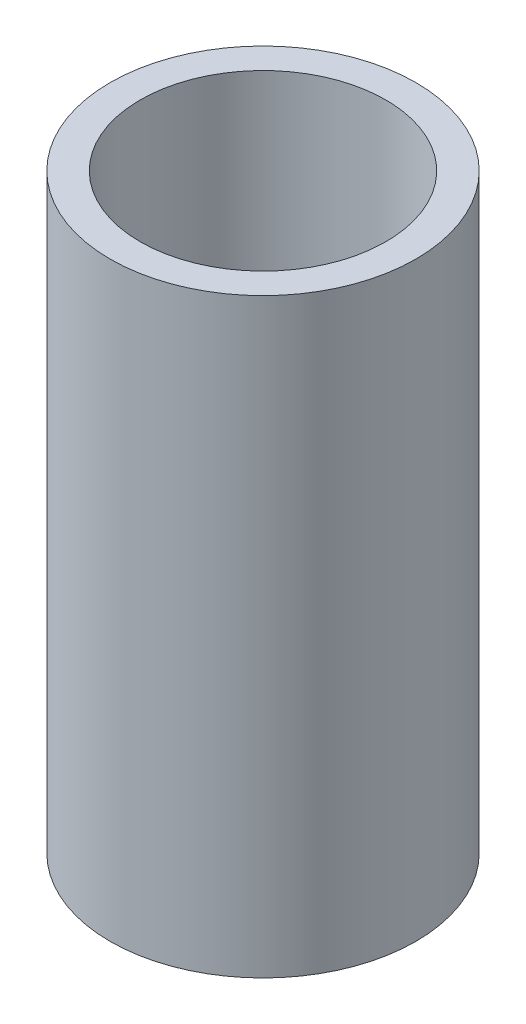
ISO-10303-21;
HEADER;
FILE_DESCRIPTION(('STEP AP214'),'2;1');
FILE_NAME('part.step','',(''),(''),'','','');
FILE_SCHEMA(('AUTOMOTIVE_DESIGN { 1 0 10303 214 1 1 1 1 }'));
ENDSEC;
DATA;
#1=APPLICATION_CONTEXT('core data for automotive mechanical design processes');
#2=APPLICATION_PROTOCOL_DEFINITION('international standard','automotive_design',2000,#1);
#3=PRODUCT_CONTEXT('',#1,'mechanical');
#4=PRODUCT('Part','Part','',(#3));
#5=PRODUCT_RELATED_PRODUCT_CATEGORY('part','',(#4));
#6=PRODUCT_DEFINITION_FORMATION('','',#4);
#7=PRODUCT_DEFINITION_CONTEXT('part definition',#1,'design');
#8=PRODUCT_DEFINITION('design','',#6,#7);
#9=PRODUCT_DEFINITION_SHAPE('','',#8);
#10=(LENGTH_UNIT() NAMED_UNIT(*) SI_UNIT(.MILLI.,.METRE.));
#11=(NAMED_UNIT(*) PLANE_ANGLE_UNIT() SI_UNIT($,.RADIAN.));
#12=(NAMED_UNIT(*) SI_UNIT($,.STERADIAN.) SOLID_ANGLE_UNIT());
#13=UNCERTAINTY_MEASURE_WITH_UNIT(LENGTH_MEASURE(1.E-05),#10,'distance_accuracy_value','');
#14=(GEOMETRIC_REPRESENTATION_CONTEXT(3) GLOBAL_UNCERTAINTY_ASSIGNED_CONTEXT((#13)) GLOBAL_UNIT_ASSIGNED_CONTEXT((#10,
#11,#12)) REPRESENTATION_CONTEXT('',''));
#15=CARTESIAN_POINT('',(0.,0.,0.));
#16=DIRECTION('',(0.,0.,1.));
#17=DIRECTION('',(1.,0.,0.));
#18=AXIS2_PLACEMENT_3D('',#15,#16,#17);
#19=CARTESIAN_POINT('',(0.,50.,0.));
#20=DIRECTION('',(0.,1.,0.));
#21=DIRECTION('',(0.,0.,1.));
#22=AXIS2_PLACEMENT_3D('',#19,#20,#21);
#23=PLANE('',#22);
#24=CARTESIAN_POINT('',(0.,50.,0.));
#25=DIRECTION('',(0.,1.,0.));
#26=DIRECTION('',(0.,0.,1.));
#27=AXIS2_PLACEMENT_3D('',#24,#25,#26);
#28=CIRCLE('',#27,12.935);
#29=CARTESIAN_POINT('',(0.,50.,12.935));
#30=VERTEX_POINT('',#29);
#31=EDGE_CURVE('E10',#30,#30,#28,.T.);
#32=ORIENTED_EDGE('',*,*,#31,.T.);
#33=EDGE_LOOP('',(#32));
#34=FACE_BOUND('',#33,.T.);
#35=CARTESIAN_POINT('',(0.,50.,0.));
#36=DIRECTION('',(0.,1.,0.));
#37=DIRECTION('',(0.,0.,1.));
#38=AXIS2_PLACEMENT_3D('',#35,#36,#37);
#39=CIRCLE('',#38,10.395);
#40=CARTESIAN_POINT('',(0.,50.,10.395));
#41=VERTEX_POINT('',#40);
#42=EDGE_CURVE('E42',#41,#41,#39,.T.);
#43=ORIENTED_EDGE('',*,*,#42,.F.);
#44=EDGE_LOOP('',(#43));
#45=FACE_BOUND('',#44,.T.);
#46=ADVANCED_FACE('F31',(#34,#45),#23,.T.);
#47=CARTESIAN_POINT('',(0.,0.,0.));
#48=DIRECTION('',(0.,1.,0.));
#49=DIRECTION('',(0.,0.,1.));
#50=AXIS2_PLACEMENT_3D('',#47,#48,#49);
#51=PLANE('',#50);
#52=CARTESIAN_POINT('',(0.,0.,0.));
#53=DIRECTION('',(0.,1.,0.));
#54=DIRECTION('',(0.,0.,1.));
#55=AXIS2_PLACEMENT_3D('',#52,#53,#54);
#56=CIRCLE('',#55,12.935);
#57=CARTESIAN_POINT('',(0.,0.,12.935));
#58=VERTEX_POINT('',#57);
#59=EDGE_CURVE('E35',#58,#58,#56,.T.);
#60=ORIENTED_EDGE('',*,*,#59,.F.);
#61=EDGE_LOOP('',(#60));
#62=FACE_BOUND('',#61,.T.);
#63=CARTESIAN_POINT('',(0.,0.,0.));
#64=DIRECTION('',(0.,1.,0.));
#65=DIRECTION('',(0.,0.,1.));
#66=AXIS2_PLACEMENT_3D('',#63,#64,#65);
#67=CIRCLE('',#66,10.395);
#68=CARTESIAN_POINT('',(0.,0.,10.395));
#69=VERTEX_POINT('',#68);
#70=EDGE_CURVE('E44',#69,#69,#67,.T.);
#71=ORIENTED_EDGE('',*,*,#70,.T.);
#72=EDGE_LOOP('',(#71));
#73=FACE_BOUND('',#72,.T.);
#74=ADVANCED_FACE('F54',(#62,#73),#51,.F.);
#75=CARTESIAN_POINT('',(0.,50.,0.));
#76=DIRECTION('',(0.,-1.,0.));
#77=DIRECTION('',(0.,0.,-1.));
#78=AXIS2_PLACEMENT_3D('',#75,#76,#77);
#79=CYLINDRICAL_SURFACE('',#78,12.935);
#80=ORIENTED_EDGE('',*,*,#31,.F.);
#81=EDGE_LOOP('',(#80));
#82=FACE_BOUND('',#81,.T.);
#83=ORIENTED_EDGE('',*,*,#59,.T.);
#84=EDGE_LOOP('',(#83));
#85=FACE_BOUND('',#84,.T.);
#86=ADVANCED_FACE('F33',(#82,#85),#79,.T.);
#87=CARTESIAN_POINT('',(0.,50.,0.));
#88=DIRECTION('',(0.,-1.,0.));
#89=DIRECTION('',(0.,0.,-1.));
#90=AXIS2_PLACEMENT_3D('',#87,#88,#89);
#91=CYLINDRICAL_SURFACE('',#90,10.395);
#92=ORIENTED_EDGE('',*,*,#42,.T.);
#93=EDGE_LOOP('',(#92));
#94=FACE_BOUND('',#93,.T.);
#95=ORIENTED_EDGE('',*,*,#70,.F.);
#96=EDGE_LOOP('',(#95));
#97=FACE_BOUND('',#96,.T.);
#98=ADVANCED_FACE('F50',(#94,#97),#91,.F.);
#99=CLOSED_SHELL('',(#46,#74,#86,#98));
#100=MANIFOLD_SOLID_BREP('B2',#99);
#101=ADVANCED_BREP_SHAPE_REPRESENTATION('',(#18,#100),#14);
#102=SHAPE_DEFINITION_REPRESENTATION(#9,#101);
ENDSEC;
END-ISO-10303-21;
